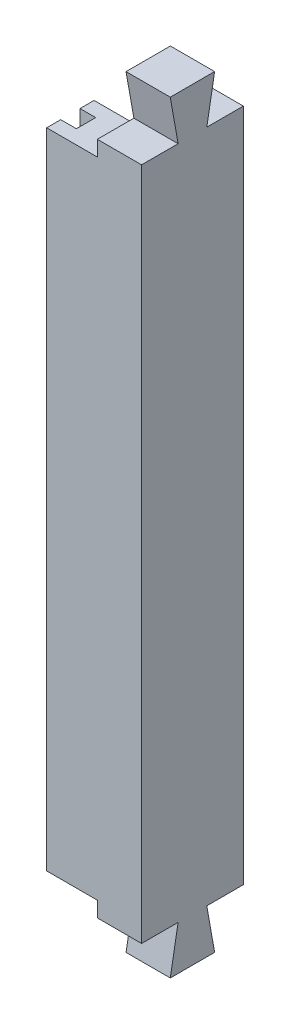
ISO-10303-21;
HEADER;
FILE_DESCRIPTION(('STEP AP214'),'2;1');
FILE_NAME('part.step','',(''),(''),'','','');
FILE_SCHEMA(('AUTOMOTIVE_DESIGN { 1 0 10303 214 1 1 1 1 }'));
ENDSEC;
DATA;
#1=APPLICATION_CONTEXT('core data for automotive mechanical design processes');
#2=APPLICATION_PROTOCOL_DEFINITION('international standard','automotive_design',2000,#1);
#3=PRODUCT_CONTEXT('',#1,'mechanical');
#4=PRODUCT('Part','Part','',(#3));
#5=PRODUCT_RELATED_PRODUCT_CATEGORY('part','',(#4));
#6=PRODUCT_DEFINITION_FORMATION('','',#4);
#7=PRODUCT_DEFINITION_CONTEXT('part definition',#1,'design');
#8=PRODUCT_DEFINITION('design','',#6,#7);
#9=PRODUCT_DEFINITION_SHAPE('','',#8);
#10=(LENGTH_UNIT() NAMED_UNIT(*) SI_UNIT(.MILLI.,.METRE.));
#11=(NAMED_UNIT(*) PLANE_ANGLE_UNIT() SI_UNIT($,.RADIAN.));
#12=(NAMED_UNIT(*) SI_UNIT($,.STERADIAN.) SOLID_ANGLE_UNIT());
#13=UNCERTAINTY_MEASURE_WITH_UNIT(LENGTH_MEASURE(1.E-05),#10,'distance_accuracy_value','');
#14=(GEOMETRIC_REPRESENTATION_CONTEXT(3) GLOBAL_UNCERTAINTY_ASSIGNED_CONTEXT((#13)) GLOBAL_UNIT_ASSIGNED_CONTEXT((#10,
#11,#12)) REPRESENTATION_CONTEXT('',''));
#15=CARTESIAN_POINT('',(0.,0.,0.));
#16=DIRECTION('',(0.,0.,1.));
#17=DIRECTION('',(1.,0.,0.));
#18=AXIS2_PLACEMENT_3D('',#15,#16,#17);
#19=CARTESIAN_POINT('',(-10.,-172.4,46.));
#20=DIRECTION('',(1.,0.,0.));
#21=DIRECTION('',(0.,0.,-1.));
#22=AXIS2_PLACEMENT_3D('',#19,#20,#21);
#23=PLANE('',#22);
#24=DIRECTION('',(0.,1.,0.));
#25=VECTOR('',#24,1.);
#26=CARTESIAN_POINT('',(-10.,0.,24.56875));
#27=LINE('',#26,#25);
#28=CARTESIAN_POINT('',(-10.,-145.45,24.56875));
#29=VERTEX_POINT('',#28);
#30=CARTESIAN_POINT('',(-10.,145.45,24.56875));
#31=VERTEX_POINT('',#30);
#32=EDGE_CURVE('E308',#29,#31,#27,.T.);
#33=ORIENTED_EDGE('',*,*,#32,.T.);
#34=DIRECTION('',(0.,0.,-1.));
#35=VECTOR('',#34,1.);
#36=CARTESIAN_POINT('',(-10.,145.45,0.));
#37=LINE('',#36,#35);
#38=CARTESIAN_POINT('',(-10.,145.45,46.));
#39=VERTEX_POINT('',#38);
#40=EDGE_CURVE('E212',#39,#31,#37,.T.);
#41=ORIENTED_EDGE('',*,*,#40,.F.);
#42=DIRECTION('',(0.,-1.,0.));
#43=VECTOR('',#42,1.);
#44=CARTESIAN_POINT('',(-10.,-172.4,46.));
#45=LINE('',#44,#43);
#46=CARTESIAN_POINT('',(-10.,152.4,46.));
#47=VERTEX_POINT('',#46);
#48=EDGE_CURVE('E38',#47,#39,#45,.T.);
#49=ORIENTED_EDGE('',*,*,#48,.F.);
#50=DIRECTION('',(0.,0.,-1.));
#51=VECTOR('',#50,1.);
#52=CARTESIAN_POINT('',(-10.,152.4,0.));
#53=LINE('',#52,#51);
#54=CARTESIAN_POINT('',(-10.,152.4,29.491));
#55=VERTEX_POINT('',#54);
#56=EDGE_CURVE('E179',#47,#55,#53,.T.);
#57=ORIENTED_EDGE('',*,*,#56,.T.);
#58=DIRECTION('',(0.,0.984808086585666,0.173646285867217));
#59=VECTOR('',#58,1.);
#60=CARTESIAN_POINT('',(-10.,-0.447882620614455,2.54009709692021));
#61=LINE('',#60,#59);
#62=CARTESIAN_POINT('',(-10.,172.4,33.0175));
#63=VERTEX_POINT('',#62);
#64=EDGE_CURVE('E192',#55,#63,#61,.T.);
#65=ORIENTED_EDGE('',*,*,#64,.T.);
#66=DIRECTION('',(0.,0.,-1.));
#67=VECTOR('',#66,1.);
#68=CARTESIAN_POINT('',(-10.,172.4,46.));
#69=LINE('',#68,#67);
#70=CARTESIAN_POINT('',(-10.,172.4,12.9825));
#71=VERTEX_POINT('',#70);
#72=EDGE_CURVE('E44',#63,#71,#69,.T.);
#73=ORIENTED_EDGE('',*,*,#72,.T.);
#74=DIRECTION('',(0.,0.984808086585666,-0.173646285867218));
#75=VECTOR('',#74,1.);
#76=CARTESIAN_POINT('',(-10.,7.41849763965528,42.0728634036879));
#77=LINE('',#76,#75);
#78=CARTESIAN_POINT('',(-10.,152.4,16.509));
#79=VERTEX_POINT('',#78);
#80=EDGE_CURVE('E298',#79,#71,#77,.T.);
#81=ORIENTED_EDGE('',*,*,#80,.F.);
#82=DIRECTION('',(0.,0.,-1.));
#83=VECTOR('',#82,1.);
#84=CARTESIAN_POINT('',(-10.,152.4,0.));
#85=LINE('',#84,#83);
#86=CARTESIAN_POINT('',(-10.,152.4,0.));
#87=VERTEX_POINT('',#86);
#88=EDGE_CURVE('E264',#79,#87,#85,.T.);
#89=ORIENTED_EDGE('',*,*,#88,.T.);
#90=DIRECTION('',(0.,-1.,0.));
#91=VECTOR('',#90,1.);
#92=CARTESIAN_POINT('',(-10.,-172.4,0.));
#93=LINE('',#92,#91);
#94=CARTESIAN_POINT('',(-10.,-152.4,0.));
#95=VERTEX_POINT('',#94);
#96=EDGE_CURVE('E199',#87,#95,#93,.T.);
#97=ORIENTED_EDGE('',*,*,#96,.T.);
#98=DIRECTION('',(0.,0.,-1.));
#99=VECTOR('',#98,1.);
#100=CARTESIAN_POINT('',(-10.,-152.4,0.));
#101=LINE('',#100,#99);
#102=CARTESIAN_POINT('',(-10.,-152.4,16.509));
#103=VERTEX_POINT('',#102);
#104=EDGE_CURVE('E269',#103,#95,#101,.T.);
#105=ORIENTED_EDGE('',*,*,#104,.F.);
#106=DIRECTION('',(0.,-0.984808086585666,-0.173646285867218));
#107=VECTOR('',#106,1.);
#108=CARTESIAN_POINT('',(-10.,-7.41849763965528,42.0728634036879));
#109=LINE('',#108,#107);
#110=CARTESIAN_POINT('',(-10.,-172.4,12.9825));
#111=VERTEX_POINT('',#110);
#112=EDGE_CURVE('E273',#103,#111,#109,.T.);
#113=ORIENTED_EDGE('',*,*,#112,.T.);
#114=DIRECTION('',(0.,0.,-1.));
#115=VECTOR('',#114,1.);
#116=CARTESIAN_POINT('',(-10.,-172.4,46.));
#117=LINE('',#116,#115);
#118=CARTESIAN_POINT('',(-10.,-172.4,33.0175));
#119=VERTEX_POINT('',#118);
#120=EDGE_CURVE('E365',#119,#111,#117,.T.);
#121=ORIENTED_EDGE('',*,*,#120,.F.);
#122=DIRECTION('',(0.,-0.984808086585666,0.173646285867217));
#123=VECTOR('',#122,1.);
#124=CARTESIAN_POINT('',(-10.,0.447882620614455,2.54009709692021));
#125=LINE('',#124,#123);
#126=CARTESIAN_POINT('',(-10.,-152.4,29.491));
#127=VERTEX_POINT('',#126);
#128=EDGE_CURVE('E251',#127,#119,#125,.T.);
#129=ORIENTED_EDGE('',*,*,#128,.F.);
#130=DIRECTION('',(0.,0.,-1.));
#131=VECTOR('',#130,1.);
#132=CARTESIAN_POINT('',(-10.,-152.4,0.));
#133=LINE('',#132,#131);
#134=CARTESIAN_POINT('',(-10.,-152.4,46.));
#135=VERTEX_POINT('',#134);
#136=EDGE_CURVE('E248',#135,#127,#133,.T.);
#137=ORIENTED_EDGE('',*,*,#136,.F.);
#138=CARTESIAN_POINT('',(-10.,-145.45,46.));
#139=VERTEX_POINT('',#138);
#140=EDGE_CURVE('E198',#139,#135,#45,.T.);
#141=ORIENTED_EDGE('',*,*,#140,.F.);
#142=DIRECTION('',(0.,0.,-1.));
#143=VECTOR('',#142,1.);
#144=CARTESIAN_POINT('',(-10.,-145.45,0.));
#145=LINE('',#144,#143);
#146=EDGE_CURVE('E214',#139,#29,#145,.T.);
#147=ORIENTED_EDGE('',*,*,#146,.T.);
#148=EDGE_LOOP('',(#33,#41,#49,#57,#65,#73,#81,#89,#97,#105,#113,#121,#129,#137,#141,#147));
#149=FACE_BOUND('',#148,.T.);
#150=ADVANCED_FACE('F34',(#149),#23,.F.);
#151=CARTESIAN_POINT('',(10.,-172.4,46.));
#152=DIRECTION('',(-1.,0.,0.));
#153=DIRECTION('',(0.,0.,1.));
#154=AXIS2_PLACEMENT_3D('',#151,#152,#153);
#155=PLANE('',#154);
#156=DIRECTION('',(0.,0.,-1.));
#157=VECTOR('',#156,1.);
#158=CARTESIAN_POINT('',(10.,152.4,0.));
#159=LINE('',#158,#157);
#160=CARTESIAN_POINT('',(10.,152.4,46.));
#161=VERTEX_POINT('',#160);
#162=CARTESIAN_POINT('',(10.,152.4,29.491));
#163=VERTEX_POINT('',#162);
#164=EDGE_CURVE('E176',#161,#163,#159,.T.);
#165=ORIENTED_EDGE('',*,*,#164,.F.);
#166=DIRECTION('',(0.,1.,0.));
#167=VECTOR('',#166,1.);
#168=CARTESIAN_POINT('',(10.,-172.4,46.));
#169=LINE('',#168,#167);
#170=CARTESIAN_POINT('',(10.,-152.4,46.));
#171=VERTEX_POINT('',#170);
#172=EDGE_CURVE('E190',#171,#161,#169,.T.);
#173=ORIENTED_EDGE('',*,*,#172,.F.);
#174=DIRECTION('',(0.,0.,-1.));
#175=VECTOR('',#174,1.);
#176=CARTESIAN_POINT('',(10.,-152.4,0.));
#177=LINE('',#176,#175);
#178=CARTESIAN_POINT('',(10.,-152.4,29.491));
#179=VERTEX_POINT('',#178);
#180=EDGE_CURVE('E282',#171,#179,#177,.T.);
#181=ORIENTED_EDGE('',*,*,#180,.T.);
#182=DIRECTION('',(0.,-0.984808086585666,0.173646285867217));
#183=VECTOR('',#182,1.);
#184=CARTESIAN_POINT('',(10.,0.447882620614455,2.54009709692021));
#185=LINE('',#184,#183);
#186=CARTESIAN_POINT('',(10.,-172.4,33.0175));
#187=VERTEX_POINT('',#186);
#188=EDGE_CURVE('E284',#179,#187,#185,.T.);
#189=ORIENTED_EDGE('',*,*,#188,.T.);
#190=DIRECTION('',(0.,0.,-1.));
#191=VECTOR('',#190,1.);
#192=CARTESIAN_POINT('',(10.,-172.4,46.));
#193=LINE('',#192,#191);
#194=CARTESIAN_POINT('',(10.,-172.4,12.9825));
#195=VERTEX_POINT('',#194);
#196=EDGE_CURVE('E363',#187,#195,#193,.T.);
#197=ORIENTED_EDGE('',*,*,#196,.T.);
#198=DIRECTION('',(0.,-0.984808086585666,-0.173646285867218));
#199=VECTOR('',#198,1.);
#200=CARTESIAN_POINT('',(10.,-7.41849763965528,42.0728634036879));
#201=LINE('',#200,#199);
#202=CARTESIAN_POINT('',(10.,-152.4,16.509));
#203=VERTEX_POINT('',#202);
#204=EDGE_CURVE('E266',#203,#195,#201,.T.);
#205=ORIENTED_EDGE('',*,*,#204,.F.);
#206=DIRECTION('',(0.,0.,-1.));
#207=VECTOR('',#206,1.);
#208=CARTESIAN_POINT('',(10.,-152.4,0.));
#209=LINE('',#208,#207);
#210=CARTESIAN_POINT('',(10.,-152.4,0.));
#211=VERTEX_POINT('',#210);
#212=EDGE_CURVE('E268',#203,#211,#209,.T.);
#213=ORIENTED_EDGE('',*,*,#212,.T.);
#214=DIRECTION('',(0.,1.,0.));
#215=VECTOR('',#214,1.);
#216=CARTESIAN_POINT('',(10.,-172.4,0.));
#217=LINE('',#216,#215);
#218=CARTESIAN_POINT('',(10.,152.4,0.));
#219=VERTEX_POINT('',#218);
#220=EDGE_CURVE('E203',#211,#219,#217,.T.);
#221=ORIENTED_EDGE('',*,*,#220,.T.);
#222=DIRECTION('',(0.,0.,-1.));
#223=VECTOR('',#222,1.);
#224=CARTESIAN_POINT('',(10.,152.4,0.));
#225=LINE('',#224,#223);
#226=CARTESIAN_POINT('',(10.,152.4,16.509));
#227=VERTEX_POINT('',#226);
#228=EDGE_CURVE('E294',#227,#219,#225,.T.);
#229=ORIENTED_EDGE('',*,*,#228,.F.);
#230=DIRECTION('',(0.,0.984808086585666,-0.173646285867218));
#231=VECTOR('',#230,1.);
#232=CARTESIAN_POINT('',(10.,7.41849763965528,42.0728634036879));
#233=LINE('',#232,#231);
#234=CARTESIAN_POINT('',(10.,172.4,12.9825));
#235=VERTEX_POINT('',#234);
#236=EDGE_CURVE('E297',#227,#235,#233,.T.);
#237=ORIENTED_EDGE('',*,*,#236,.T.);
#238=DIRECTION('',(0.,0.,-1.));
#239=VECTOR('',#238,1.);
#240=CARTESIAN_POINT('',(10.,172.4,46.));
#241=LINE('',#240,#239);
#242=CARTESIAN_POINT('',(10.,172.4,33.0175));
#243=VERTEX_POINT('',#242);
#244=EDGE_CURVE('E11',#243,#235,#241,.T.);
#245=ORIENTED_EDGE('',*,*,#244,.F.);
#246=DIRECTION('',(0.,0.984808086585666,0.173646285867217));
#247=VECTOR('',#246,1.);
#248=CARTESIAN_POINT('',(10.,-0.447882620614455,2.54009709692021));
#249=LINE('',#248,#247);
#250=EDGE_CURVE('E184',#163,#243,#249,.T.);
#251=ORIENTED_EDGE('',*,*,#250,.F.);
#252=EDGE_LOOP('',(#165,#173,#181,#189,#197,#205,#213,#221,#229,#237,#245,#251));
#253=FACE_BOUND('',#252,.T.);
#254=ADVANCED_FACE('F36',(#253),#155,.F.);
#255=CARTESIAN_POINT('',(-10.,172.4,46.));
#256=DIRECTION('',(0.,-1.,0.));
#257=DIRECTION('',(0.,0.,-1.));
#258=AXIS2_PLACEMENT_3D('',#255,#256,#257);
#259=PLANE('',#258);
#260=DIRECTION('',(-1.,0.,0.));
#261=VECTOR('',#260,1.);
#262=CARTESIAN_POINT('',(10.,172.4,33.0175));
#263=LINE('',#262,#261);
#264=EDGE_CURVE('E183',#243,#63,#263,.T.);
#265=ORIENTED_EDGE('',*,*,#264,.F.);
#266=ORIENTED_EDGE('',*,*,#244,.T.);
#267=DIRECTION('',(-1.,0.,0.));
#268=VECTOR('',#267,1.);
#269=CARTESIAN_POINT('',(10.,172.4,12.9825));
#270=LINE('',#269,#268);
#271=EDGE_CURVE('E309',#235,#71,#270,.T.);
#272=ORIENTED_EDGE('',*,*,#271,.T.);
#273=ORIENTED_EDGE('',*,*,#72,.F.);
#274=EDGE_LOOP('',(#265,#266,#272,#273));
#275=FACE_BOUND('',#274,.T.);
#276=ADVANCED_FACE('F380',(#275),#259,.F.);
#277=CARTESIAN_POINT('',(-10.,-172.4,46.));
#278=DIRECTION('',(0.,1.,0.));
#279=DIRECTION('',(0.,0.,1.));
#280=AXIS2_PLACEMENT_3D('',#277,#278,#279);
#281=PLANE('',#280);
#282=DIRECTION('',(-1.,0.,0.));
#283=VECTOR('',#282,1.);
#284=CARTESIAN_POINT('',(10.,-172.4,12.9825));
#285=LINE('',#284,#283);
#286=EDGE_CURVE('E259',#195,#111,#285,.T.);
#287=ORIENTED_EDGE('',*,*,#286,.F.);
#288=ORIENTED_EDGE('',*,*,#196,.F.);
#289=DIRECTION('',(-1.,0.,0.));
#290=VECTOR('',#289,1.);
#291=CARTESIAN_POINT('',(10.,-172.4,33.0175));
#292=LINE('',#291,#290);
#293=EDGE_CURVE('E290',#187,#119,#292,.T.);
#294=ORIENTED_EDGE('',*,*,#293,.T.);
#295=ORIENTED_EDGE('',*,*,#120,.T.);
#296=EDGE_LOOP('',(#287,#288,#294,#295));
#297=FACE_BOUND('',#296,.T.);
#298=ADVANCED_FACE('F399',(#297),#281,.F.);
#299=CARTESIAN_POINT('',(0.,0.,46.));
#300=DIRECTION('',(0.,0.,-1.));
#301=DIRECTION('',(-1.,0.,0.));
#302=AXIS2_PLACEMENT_3D('',#299,#300,#301);
#303=PLANE('',#302);
#304=DIRECTION('',(-1.,0.,0.));
#305=VECTOR('',#304,1.);
#306=CARTESIAN_POINT('',(10.,152.4,46.));
#307=LINE('',#306,#305);
#308=EDGE_CURVE('E172',#161,#47,#307,.T.);
#309=ORIENTED_EDGE('',*,*,#308,.T.);
#310=ORIENTED_EDGE('',*,*,#48,.T.);
#311=DIRECTION('',(1.,0.,0.));
#312=VECTOR('',#311,1.);
#313=CARTESIAN_POINT('',(-32.9,145.45,46.));
#314=LINE('',#313,#312);
#315=CARTESIAN_POINT('',(-32.9,145.45,46.));
#316=VERTEX_POINT('',#315);
#317=EDGE_CURVE('E218',#316,#39,#314,.T.);
#318=ORIENTED_EDGE('',*,*,#317,.F.);
#319=DIRECTION('',(0.,1.,0.));
#320=VECTOR('',#319,1.);
#321=CARTESIAN_POINT('',(-32.9,0.,46.));
#322=LINE('',#321,#320);
#323=CARTESIAN_POINT('',(-32.9,-145.45,46.));
#324=VERTEX_POINT('',#323);
#325=EDGE_CURVE('E230',#324,#316,#322,.T.);
#326=ORIENTED_EDGE('',*,*,#325,.F.);
#327=DIRECTION('',(1.,0.,0.));
#328=VECTOR('',#327,1.);
#329=CARTESIAN_POINT('',(-32.9,-145.45,46.));
#330=LINE('',#329,#328);
#331=EDGE_CURVE('E223',#324,#139,#330,.T.);
#332=ORIENTED_EDGE('',*,*,#331,.T.);
#333=ORIENTED_EDGE('',*,*,#140,.T.);
#334=DIRECTION('',(-1.,0.,0.));
#335=VECTOR('',#334,1.);
#336=CARTESIAN_POINT('',(10.,-152.4,46.));
#337=LINE('',#336,#335);
#338=EDGE_CURVE('E197',#171,#135,#337,.T.);
#339=ORIENTED_EDGE('',*,*,#338,.F.);
#340=ORIENTED_EDGE('',*,*,#172,.T.);
#341=EDGE_LOOP('',(#309,#310,#318,#326,#332,#333,#339,#340));
#342=FACE_BOUND('',#341,.T.);
#343=ADVANCED_FACE('F195',(#342),#303,.F.);
#344=CARTESIAN_POINT('',(0.,0.,0.));
#345=DIRECTION('',(0.,0.,-1.));
#346=DIRECTION('',(-1.,0.,0.));
#347=AXIS2_PLACEMENT_3D('',#344,#345,#346);
#348=PLANE('',#347);
#349=DIRECTION('',(-1.,0.,0.));
#350=VECTOR('',#349,1.);
#351=CARTESIAN_POINT('',(10.,-152.4,0.));
#352=LINE('',#351,#350);
#353=EDGE_CURVE('E278',#211,#95,#352,.T.);
#354=ORIENTED_EDGE('',*,*,#353,.T.);
#355=ORIENTED_EDGE('',*,*,#96,.F.);
#356=DIRECTION('',(-1.,0.,0.));
#357=VECTOR('',#356,1.);
#358=CARTESIAN_POINT('',(10.,152.4,0.));
#359=LINE('',#358,#357);
#360=EDGE_CURVE('E306',#219,#87,#359,.T.);
#361=ORIENTED_EDGE('',*,*,#360,.F.);
#362=ORIENTED_EDGE('',*,*,#220,.F.);
#363=EDGE_LOOP('',(#354,#355,#361,#362));
#364=FACE_BOUND('',#363,.T.);
#365=ADVANCED_FACE('F388',(#364),#348,.T.);
#366=CARTESIAN_POINT('',(-32.9,145.45,0.));
#367=DIRECTION('',(0.,-1.,0.));
#368=DIRECTION('',(0.,0.,-1.));
#369=AXIS2_PLACEMENT_3D('',#366,#367,#368);
#370=PLANE('',#369);
#371=ORIENTED_EDGE('',*,*,#40,.T.);
#372=DIRECTION('',(1.,0.,0.));
#373=VECTOR('',#372,1.);
#374=CARTESIAN_POINT('',(-32.9,145.45,24.56875));
#375=LINE('',#374,#373);
#376=CARTESIAN_POINT('',(-32.9,145.45,24.56875));
#377=VERTEX_POINT('',#376);
#378=EDGE_CURVE('E331',#377,#31,#375,.T.);
#379=ORIENTED_EDGE('',*,*,#378,.F.);
#380=DIRECTION('',(0.,0.,-1.));
#381=VECTOR('',#380,1.);
#382=CARTESIAN_POINT('',(-32.9,145.45,0.));
#383=LINE('',#382,#381);
#384=CARTESIAN_POINT('',(-32.9,145.45,30.91875));
#385=VERTEX_POINT('',#384);
#386=EDGE_CURVE('E316',#385,#377,#383,.T.);
#387=ORIENTED_EDGE('',*,*,#386,.F.);
#388=DIRECTION('',(1.,0.,0.));
#389=VECTOR('',#388,1.);
#390=CARTESIAN_POINT('',(-32.9,145.45,30.91875));
#391=LINE('',#390,#389);
#392=CARTESIAN_POINT('',(-25.8,145.45,30.91875));
#393=VERTEX_POINT('',#392);
#394=EDGE_CURVE('E215',#385,#393,#391,.T.);
#395=ORIENTED_EDGE('',*,*,#394,.T.);
#396=DIRECTION('',(0.,0.,-1.));
#397=VECTOR('',#396,1.);
#398=CARTESIAN_POINT('',(-25.8,145.45,0.));
#399=LINE('',#398,#397);
#400=CARTESIAN_POINT('',(-25.8,145.45,39.65));
#401=VERTEX_POINT('',#400);
#402=EDGE_CURVE('E253',#401,#393,#399,.T.);
#403=ORIENTED_EDGE('',*,*,#402,.F.);
#404=DIRECTION('',(1.,0.,0.));
#405=VECTOR('',#404,1.);
#406=CARTESIAN_POINT('',(-32.9,145.45,39.65));
#407=LINE('',#406,#405);
#408=CARTESIAN_POINT('',(-32.9,145.45,39.65));
#409=VERTEX_POINT('',#408);
#410=EDGE_CURVE('E52',#409,#401,#407,.T.);
#411=ORIENTED_EDGE('',*,*,#410,.F.);
#412=DIRECTION('',(0.,0.,-1.));
#413=VECTOR('',#412,1.);
#414=CARTESIAN_POINT('',(-32.9,145.45,0.));
#415=LINE('',#414,#413);
#416=EDGE_CURVE('E338',#316,#409,#415,.T.);
#417=ORIENTED_EDGE('',*,*,#416,.F.);
#418=ORIENTED_EDGE('',*,*,#317,.T.);
#419=EDGE_LOOP('',(#371,#379,#387,#395,#403,#411,#417,#418));
#420=FACE_BOUND('',#419,.T.);
#421=ADVANCED_FACE('F346',(#420),#370,.F.);
#422=CARTESIAN_POINT('',(-32.9,0.,39.65));
#423=DIRECTION('',(0.,0.,-1.));
#424=DIRECTION('',(-1.,0.,0.));
#425=AXIS2_PLACEMENT_3D('',#422,#423,#424);
#426=PLANE('',#425);
#427=DIRECTION('',(0.,1.,0.));
#428=VECTOR('',#427,1.);
#429=CARTESIAN_POINT('',(-25.8,0.,39.65));
#430=LINE('',#429,#428);
#431=CARTESIAN_POINT('',(-25.8,-145.45,39.65));
#432=VERTEX_POINT('',#431);
#433=EDGE_CURVE('E57',#432,#401,#430,.T.);
#434=ORIENTED_EDGE('',*,*,#433,.F.);
#435=DIRECTION('',(1.,0.,0.));
#436=VECTOR('',#435,1.);
#437=CARTESIAN_POINT('',(-32.9,-145.45,39.65));
#438=LINE('',#437,#436);
#439=CARTESIAN_POINT('',(-32.9,-145.45,39.65));
#440=VERTEX_POINT('',#439);
#441=EDGE_CURVE('E226',#440,#432,#438,.T.);
#442=ORIENTED_EDGE('',*,*,#441,.F.);
#443=DIRECTION('',(0.,1.,0.));
#444=VECTOR('',#443,1.);
#445=CARTESIAN_POINT('',(-32.9,0.,39.65));
#446=LINE('',#445,#444);
#447=EDGE_CURVE('E339',#440,#409,#446,.T.);
#448=ORIENTED_EDGE('',*,*,#447,.T.);
#449=ORIENTED_EDGE('',*,*,#410,.T.);
#450=EDGE_LOOP('',(#434,#442,#448,#449));
#451=FACE_BOUND('',#450,.T.);
#452=ADVANCED_FACE('F340',(#451),#426,.T.);
#453=CARTESIAN_POINT('',(-32.9,-145.45,0.));
#454=DIRECTION('',(0.,-1.,0.));
#455=DIRECTION('',(0.,0.,-1.));
#456=AXIS2_PLACEMENT_3D('',#453,#454,#455);
#457=PLANE('',#456);
#458=ORIENTED_EDGE('',*,*,#146,.F.);
#459=ORIENTED_EDGE('',*,*,#331,.F.);
#460=DIRECTION('',(0.,0.,-1.));
#461=VECTOR('',#460,1.);
#462=CARTESIAN_POINT('',(-32.9,-145.45,0.));
#463=LINE('',#462,#461);
#464=EDGE_CURVE('E227',#324,#440,#463,.T.);
#465=ORIENTED_EDGE('',*,*,#464,.T.);
#466=ORIENTED_EDGE('',*,*,#441,.T.);
#467=DIRECTION('',(0.,0.,-1.));
#468=VECTOR('',#467,1.);
#469=CARTESIAN_POINT('',(-25.8,-145.45,0.));
#470=LINE('',#469,#468);
#471=CARTESIAN_POINT('',(-25.8,-145.45,30.91875));
#472=VERTEX_POINT('',#471);
#473=EDGE_CURVE('E240',#432,#472,#470,.T.);
#474=ORIENTED_EDGE('',*,*,#473,.T.);
#475=DIRECTION('',(1.,0.,0.));
#476=VECTOR('',#475,1.);
#477=CARTESIAN_POINT('',(-32.9,-145.45,30.91875));
#478=LINE('',#477,#476);
#479=CARTESIAN_POINT('',(-32.9,-145.45,30.91875));
#480=VERTEX_POINT('',#479);
#481=EDGE_CURVE('E324',#480,#472,#478,.T.);
#482=ORIENTED_EDGE('',*,*,#481,.F.);
#483=DIRECTION('',(0.,0.,-1.));
#484=VECTOR('',#483,1.);
#485=CARTESIAN_POINT('',(-32.9,-145.45,0.));
#486=LINE('',#485,#484);
#487=CARTESIAN_POINT('',(-32.9,-145.45,24.56875));
#488=VERTEX_POINT('',#487);
#489=EDGE_CURVE('E321',#480,#488,#486,.T.);
#490=ORIENTED_EDGE('',*,*,#489,.T.);
#491=DIRECTION('',(1.,0.,0.));
#492=VECTOR('',#491,1.);
#493=CARTESIAN_POINT('',(-32.9,-145.45,24.56875));
#494=LINE('',#493,#492);
#495=EDGE_CURVE('E328',#488,#29,#494,.T.);
#496=ORIENTED_EDGE('',*,*,#495,.T.);
#497=EDGE_LOOP('',(#458,#459,#465,#466,#474,#482,#490,#496));
#498=FACE_BOUND('',#497,.T.);
#499=ADVANCED_FACE('F239',(#498),#457,.T.);
#500=CARTESIAN_POINT('',(-32.9,0.,0.));
#501=DIRECTION('',(-1.,0.,0.));
#502=DIRECTION('',(0.,0.,1.));
#503=AXIS2_PLACEMENT_3D('',#500,#501,#502);
#504=PLANE('',#503);
#505=ORIENTED_EDGE('',*,*,#325,.T.);
#506=ORIENTED_EDGE('',*,*,#416,.T.);
#507=ORIENTED_EDGE('',*,*,#447,.F.);
#508=ORIENTED_EDGE('',*,*,#464,.F.);
#509=EDGE_LOOP('',(#505,#506,#507,#508));
#510=FACE_BOUND('',#509,.T.);
#511=ADVANCED_FACE('F342',(#510),#504,.T.);
#512=CARTESIAN_POINT('',(-32.9,0.,30.91875));
#513=DIRECTION('',(0.,0.,-1.));
#514=DIRECTION('',(-1.,0.,0.));
#515=AXIS2_PLACEMENT_3D('',#512,#513,#514);
#516=PLANE('',#515);
#517=ORIENTED_EDGE('',*,*,#481,.T.);
#518=DIRECTION('',(0.,1.,0.));
#519=VECTOR('',#518,1.);
#520=CARTESIAN_POINT('',(-25.8,0.,30.91875));
#521=LINE('',#520,#519);
#522=EDGE_CURVE('E247',#472,#393,#521,.T.);
#523=ORIENTED_EDGE('',*,*,#522,.T.);
#524=ORIENTED_EDGE('',*,*,#394,.F.);
#525=DIRECTION('',(0.,1.,0.));
#526=VECTOR('',#525,1.);
#527=CARTESIAN_POINT('',(-32.9,0.,30.91875));
#528=LINE('',#527,#526);
#529=EDGE_CURVE('E313',#480,#385,#528,.T.);
#530=ORIENTED_EDGE('',*,*,#529,.F.);
#531=EDGE_LOOP('',(#517,#523,#524,#530));
#532=FACE_BOUND('',#531,.T.);
#533=ADVANCED_FACE('F352',(#532),#516,.F.);
#534=CARTESIAN_POINT('',(-32.9,0.,24.56875));
#535=DIRECTION('',(0.,0.,-1.));
#536=DIRECTION('',(-1.,0.,0.));
#537=AXIS2_PLACEMENT_3D('',#534,#535,#536);
#538=PLANE('',#537);
#539=ORIENTED_EDGE('',*,*,#32,.F.);
#540=ORIENTED_EDGE('',*,*,#495,.F.);
#541=DIRECTION('',(0.,1.,0.));
#542=VECTOR('',#541,1.);
#543=CARTESIAN_POINT('',(-32.9,0.,24.56875));
#544=LINE('',#543,#542);
#545=EDGE_CURVE('E318',#488,#377,#544,.T.);
#546=ORIENTED_EDGE('',*,*,#545,.T.);
#547=ORIENTED_EDGE('',*,*,#378,.T.);
#548=EDGE_LOOP('',(#539,#540,#546,#547));
#549=FACE_BOUND('',#548,.T.);
#550=ADVANCED_FACE('F359',(#549),#538,.T.);
#551=CARTESIAN_POINT('',(-32.9,0.,0.));
#552=DIRECTION('',(-1.,0.,0.));
#553=DIRECTION('',(0.,0.,1.));
#554=AXIS2_PLACEMENT_3D('',#551,#552,#553);
#555=PLANE('',#554);
#556=ORIENTED_EDGE('',*,*,#529,.T.);
#557=ORIENTED_EDGE('',*,*,#386,.T.);
#558=ORIENTED_EDGE('',*,*,#545,.F.);
#559=ORIENTED_EDGE('',*,*,#489,.F.);
#560=EDGE_LOOP('',(#556,#557,#558,#559));
#561=FACE_BOUND('',#560,.T.);
#562=ADVANCED_FACE('F356',(#561),#555,.T.);
#563=CARTESIAN_POINT('',(10.,152.4,0.));
#564=DIRECTION('',(0.,1.,0.));
#565=DIRECTION('',(0.,0.,1.));
#566=AXIS2_PLACEMENT_3D('',#563,#564,#565);
#567=PLANE('',#566);
#568=ORIENTED_EDGE('',*,*,#88,.F.);
#569=DIRECTION('',(-1.,0.,0.));
#570=VECTOR('',#569,1.);
#571=CARTESIAN_POINT('',(10.,152.4,16.509));
#572=LINE('',#571,#570);
#573=EDGE_CURVE('E301',#227,#79,#572,.T.);
#574=ORIENTED_EDGE('',*,*,#573,.F.);
#575=ORIENTED_EDGE('',*,*,#228,.T.);
#576=ORIENTED_EDGE('',*,*,#360,.T.);
#577=EDGE_LOOP('',(#568,#574,#575,#576));
#578=FACE_BOUND('',#577,.T.);
#579=ADVANCED_FACE('F385',(#578),#567,.T.);
#580=CARTESIAN_POINT('',(10.,7.41849763965528,42.0728634036879));
#581=DIRECTION('',(0.,0.173646285867218,0.984808086585666));
#582=DIRECTION('',(0.,-0.984808086585666,0.173646285867218));
#583=AXIS2_PLACEMENT_3D('',#580,#581,#582);
#584=PLANE('',#583);
#585=ORIENTED_EDGE('',*,*,#80,.T.);
#586=ORIENTED_EDGE('',*,*,#271,.F.);
#587=ORIENTED_EDGE('',*,*,#236,.F.);
#588=ORIENTED_EDGE('',*,*,#573,.T.);
#589=EDGE_LOOP('',(#585,#586,#587,#588));
#590=FACE_BOUND('',#589,.T.);
#591=ADVANCED_FACE('F377',(#590),#584,.F.);
#592=CARTESIAN_POINT('',(10.,-152.4,0.));
#593=DIRECTION('',(0.,1.,0.));
#594=DIRECTION('',(0.,0.,1.));
#595=AXIS2_PLACEMENT_3D('',#592,#593,#594);
#596=PLANE('',#595);
#597=ORIENTED_EDGE('',*,*,#136,.T.);
#598=DIRECTION('',(-1.,0.,0.));
#599=VECTOR('',#598,1.);
#600=CARTESIAN_POINT('',(10.,-152.4,29.491));
#601=LINE('',#600,#599);
#602=EDGE_CURVE('E286',#179,#127,#601,.T.);
#603=ORIENTED_EDGE('',*,*,#602,.F.);
#604=ORIENTED_EDGE('',*,*,#180,.F.);
#605=ORIENTED_EDGE('',*,*,#338,.T.);
#606=EDGE_LOOP('',(#597,#603,#604,#605));
#607=FACE_BOUND('',#606,.T.);
#608=ADVANCED_FACE('F405',(#607),#596,.F.);
#609=CARTESIAN_POINT('',(10.,0.447882620614455,2.54009709692021));
#610=DIRECTION('',(0.,-0.173646285867217,-0.984808086585666));
#611=DIRECTION('',(0.,0.984808086585666,-0.173646285867217));
#612=AXIS2_PLACEMENT_3D('',#609,#610,#611);
#613=PLANE('',#612);
#614=ORIENTED_EDGE('',*,*,#128,.T.);
#615=ORIENTED_EDGE('',*,*,#293,.F.);
#616=ORIENTED_EDGE('',*,*,#188,.F.);
#617=ORIENTED_EDGE('',*,*,#602,.T.);
#618=EDGE_LOOP('',(#614,#615,#616,#617));
#619=FACE_BOUND('',#618,.T.);
#620=ADVANCED_FACE('F402',(#619),#613,.F.);
#621=CARTESIAN_POINT('',(10.,152.4,0.));
#622=DIRECTION('',(0.,1.,0.));
#623=DIRECTION('',(0.,0.,1.));
#624=AXIS2_PLACEMENT_3D('',#621,#622,#623);
#625=PLANE('',#624);
#626=ORIENTED_EDGE('',*,*,#56,.F.);
#627=ORIENTED_EDGE('',*,*,#308,.F.);
#628=ORIENTED_EDGE('',*,*,#164,.T.);
#629=DIRECTION('',(-1.,0.,0.));
#630=VECTOR('',#629,1.);
#631=CARTESIAN_POINT('',(10.,152.4,29.491));
#632=LINE('',#631,#630);
#633=EDGE_CURVE('E262',#163,#55,#632,.T.);
#634=ORIENTED_EDGE('',*,*,#633,.T.);
#635=EDGE_LOOP('',(#626,#627,#628,#634));
#636=FACE_BOUND('',#635,.T.);
#637=ADVANCED_FACE('F174',(#636),#625,.T.);
#638=CARTESIAN_POINT('',(10.,-0.447882620614455,2.54009709692021));
#639=DIRECTION('',(0.,-0.173646285867217,0.984808086585666));
#640=DIRECTION('',(0.,-0.984808086585666,-0.173646285867217));
#641=AXIS2_PLACEMENT_3D('',#638,#639,#640);
#642=PLANE('',#641);
#643=ORIENTED_EDGE('',*,*,#64,.F.);
#644=ORIENTED_EDGE('',*,*,#633,.F.);
#645=ORIENTED_EDGE('',*,*,#250,.T.);
#646=ORIENTED_EDGE('',*,*,#264,.T.);
#647=EDGE_LOOP('',(#643,#644,#645,#646));
#648=FACE_BOUND('',#647,.T.);
#649=ADVANCED_FACE('F476',(#648),#642,.T.);
#650=CARTESIAN_POINT('',(10.,-7.41849763965528,42.0728634036879));
#651=DIRECTION('',(0.,0.173646285867218,-0.984808086585666));
#652=DIRECTION('',(0.,0.984808086585666,0.173646285867218));
#653=AXIS2_PLACEMENT_3D('',#650,#651,#652);
#654=PLANE('',#653);
#655=ORIENTED_EDGE('',*,*,#112,.F.);
#656=DIRECTION('',(-1.,0.,0.));
#657=VECTOR('',#656,1.);
#658=CARTESIAN_POINT('',(10.,-152.4,16.509));
#659=LINE('',#658,#657);
#660=EDGE_CURVE('E272',#203,#103,#659,.T.);
#661=ORIENTED_EDGE('',*,*,#660,.F.);
#662=ORIENTED_EDGE('',*,*,#204,.T.);
#663=ORIENTED_EDGE('',*,*,#286,.T.);
#664=EDGE_LOOP('',(#655,#661,#662,#663));
#665=FACE_BOUND('',#664,.T.);
#666=ADVANCED_FACE('F396',(#665),#654,.T.);
#667=CARTESIAN_POINT('',(10.,-152.4,0.));
#668=DIRECTION('',(0.,1.,0.));
#669=DIRECTION('',(0.,0.,1.));
#670=AXIS2_PLACEMENT_3D('',#667,#668,#669);
#671=PLANE('',#670);
#672=ORIENTED_EDGE('',*,*,#104,.T.);
#673=ORIENTED_EDGE('',*,*,#353,.F.);
#674=ORIENTED_EDGE('',*,*,#212,.F.);
#675=ORIENTED_EDGE('',*,*,#660,.T.);
#676=EDGE_LOOP('',(#672,#673,#674,#675));
#677=FACE_BOUND('',#676,.T.);
#678=ADVANCED_FACE('F393',(#677),#671,.F.);
#679=CARTESIAN_POINT('',(-25.8,0.,0.));
#680=DIRECTION('',(-1.,0.,0.));
#681=DIRECTION('',(0.,0.,1.));
#682=AXIS2_PLACEMENT_3D('',#679,#680,#681);
#683=PLANE('',#682);
#684=ORIENTED_EDGE('',*,*,#433,.T.);
#685=ORIENTED_EDGE('',*,*,#402,.T.);
#686=ORIENTED_EDGE('',*,*,#522,.F.);
#687=ORIENTED_EDGE('',*,*,#473,.F.);
#688=EDGE_LOOP('',(#684,#685,#686,#687));
#689=FACE_BOUND('',#688,.T.);
#690=ADVANCED_FACE('F245',(#689),#683,.T.);
#691=CLOSED_SHELL('',(#150,#254,#276,#298,#343,#365,#421,#452,#499,#511,#533,#550,#562,#579,
#591,#608,#620,#637,#649,#666,#678,#690));
#692=MANIFOLD_SOLID_BREP('B2',#691);
#693=ADVANCED_BREP_SHAPE_REPRESENTATION('',(#18,#692),#14);
#694=SHAPE_DEFINITION_REPRESENTATION(#9,#693);
ENDSEC;
END-ISO-10303-21;
